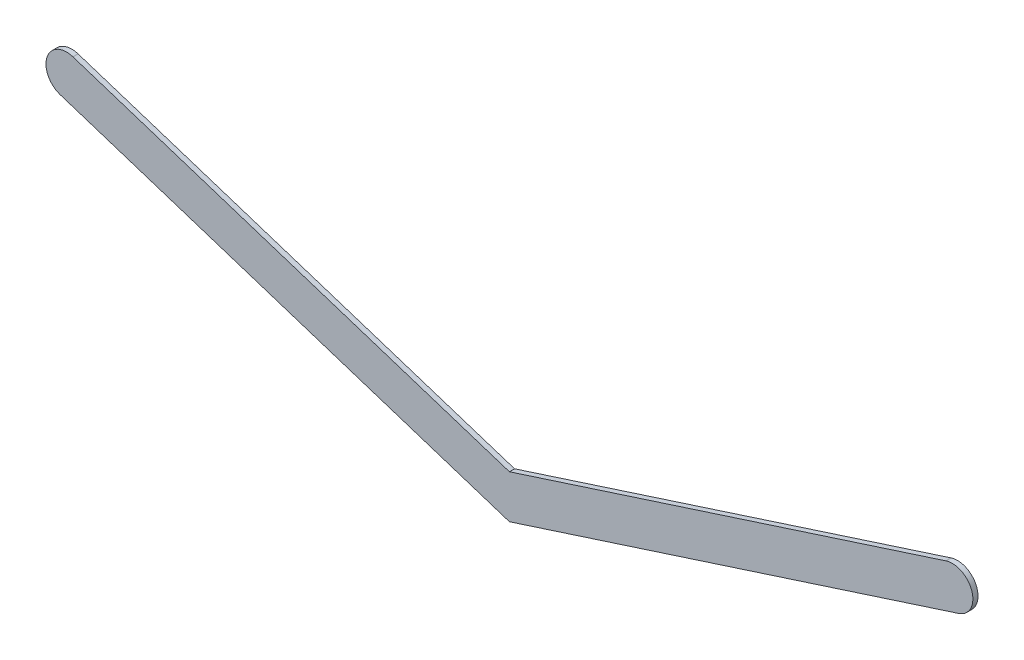
ISO-10303-21;
HEADER;
FILE_DESCRIPTION(('STEP AP214'),'2;1');
FILE_NAME('part.step','',(''),(''),'','','');
FILE_SCHEMA(('AUTOMOTIVE_DESIGN { 1 0 10303 214 1 1 1 1 }'));
ENDSEC;
DATA;
#1=APPLICATION_CONTEXT('core data for automotive mechanical design processes');
#2=APPLICATION_PROTOCOL_DEFINITION('international standard','automotive_design',2000,#1);
#3=PRODUCT_CONTEXT('',#1,'mechanical');
#4=PRODUCT('Part','Part','',(#3));
#5=PRODUCT_RELATED_PRODUCT_CATEGORY('part','',(#4));
#6=PRODUCT_DEFINITION_FORMATION('','',#4);
#7=PRODUCT_DEFINITION_CONTEXT('part definition',#1,'design');
#8=PRODUCT_DEFINITION('design','',#6,#7);
#9=PRODUCT_DEFINITION_SHAPE('','',#8);
#10=(LENGTH_UNIT() NAMED_UNIT(*) SI_UNIT(.MILLI.,.METRE.));
#11=(NAMED_UNIT(*) PLANE_ANGLE_UNIT() SI_UNIT($,.RADIAN.));
#12=(NAMED_UNIT(*) SI_UNIT($,.STERADIAN.) SOLID_ANGLE_UNIT());
#13=UNCERTAINTY_MEASURE_WITH_UNIT(LENGTH_MEASURE(1.E-05),#10,'distance_accuracy_value','');
#14=(GEOMETRIC_REPRESENTATION_CONTEXT(3) GLOBAL_UNCERTAINTY_ASSIGNED_CONTEXT((#13)) GLOBAL_UNIT_ASSIGNED_CONTEXT((#10,
#11,#12)) REPRESENTATION_CONTEXT('',''));
#15=CARTESIAN_POINT('',(0.,0.,0.));
#16=DIRECTION('',(0.,0.,1.));
#17=DIRECTION('',(1.,0.,0.));
#18=AXIS2_PLACEMENT_3D('',#15,#16,#17);
#19=CARTESIAN_POINT('',(546.1,0.,3.175));
#20=DIRECTION('',(0.,0.,-1.));
#21=DIRECTION('',(-1.,0.,0.));
#22=AXIS2_PLACEMENT_3D('',#19,#20,#21);
#23=CYLINDRICAL_SURFACE('',#22,25.4);
#24=CARTESIAN_POINT('',(546.1,0.,-3.175));
#25=DIRECTION('',(0.,0.,1.));
#26=DIRECTION('',(1.,0.,0.));
#27=AXIS2_PLACEMENT_3D('',#24,#25,#26);
#28=CIRCLE('',#27,25.4);
#29=CARTESIAN_POINT('',(553.911696572008,-24.1689345372708,-3.175));
#30=VERTEX_POINT('',#29);
#31=CARTESIAN_POINT('',(538.288303427992,24.1689345372708,-3.175));
#32=VERTEX_POINT('',#31);
#33=EDGE_CURVE('E119',#30,#32,#28,.T.);
#34=ORIENTED_EDGE('',*,*,#33,.T.);
#35=DIRECTION('',(0.,0.,-1.));
#36=VECTOR('',#35,1.);
#37=CARTESIAN_POINT('',(538.288303427992,24.1689345372708,3.175));
#38=LINE('',#37,#36);
#39=CARTESIAN_POINT('',(538.288303427992,24.1689345372708,3.175));
#40=VERTEX_POINT('',#39);
#41=EDGE_CURVE('E11',#40,#32,#38,.T.);
#42=ORIENTED_EDGE('',*,*,#41,.F.);
#43=CARTESIAN_POINT('',(546.1,0.,3.175));
#44=DIRECTION('',(0.,0.,1.));
#45=DIRECTION('',(1.,0.,0.));
#46=AXIS2_PLACEMENT_3D('',#43,#44,#45);
#47=CIRCLE('',#46,25.4);
#48=CARTESIAN_POINT('',(553.911696572008,-24.1689345372708,3.175));
#49=VERTEX_POINT('',#48);
#50=EDGE_CURVE('E129',#49,#40,#47,.T.);
#51=ORIENTED_EDGE('',*,*,#50,.F.);
#52=DIRECTION('',(0.,0.,-1.));
#53=VECTOR('',#52,1.);
#54=CARTESIAN_POINT('',(553.911696572008,-24.1689345372708,3.175));
#55=LINE('',#54,#53);
#56=EDGE_CURVE('E115',#49,#30,#55,.T.);
#57=ORIENTED_EDGE('',*,*,#56,.T.);
#58=EDGE_LOOP('',(#34,#42,#51,#57));
#59=FACE_BOUND('',#58,.T.);
#60=ADVANCED_FACE('F35',(#59),#23,.T.);
#61=CARTESIAN_POINT('',(0.,-149.812458318748,3.175));
#62=DIRECTION('',(0.307547109134163,-0.951532855798064,0.));
#63=DIRECTION('',(0.951532855798064,0.307547109134163,0.));
#64=AXIS2_PLACEMENT_3D('',#61,#62,#63);
#65=PLANE('',#64);
#66=DIRECTION('',(-0.951532855798064,-0.307547109134163,0.));
#67=VECTOR('',#66,1.);
#68=CARTESIAN_POINT('',(0.,-149.812458318748,-3.175));
#69=LINE('',#68,#67);
#70=CARTESIAN_POINT('',(0.,-149.812458318748,-3.175));
#71=VERTEX_POINT('',#70);
#72=EDGE_CURVE('E122',#32,#71,#69,.T.);
#73=ORIENTED_EDGE('',*,*,#72,.T.);
#74=DIRECTION('',(0.,0.,-1.));
#75=VECTOR('',#74,1.);
#76=CARTESIAN_POINT('',(0.,-149.812458318748,3.175));
#77=LINE('',#76,#75);
#78=CARTESIAN_POINT('',(0.,-149.812458318748,3.175));
#79=VERTEX_POINT('',#78);
#80=EDGE_CURVE('E43',#79,#71,#77,.T.);
#81=ORIENTED_EDGE('',*,*,#80,.F.);
#82=DIRECTION('',(-0.951532855798064,-0.307547109134163,0.));
#83=VECTOR('',#82,1.);
#84=CARTESIAN_POINT('',(0.,-149.812458318748,3.175));
#85=LINE('',#84,#83);
#86=EDGE_CURVE('E88',#40,#79,#85,.T.);
#87=ORIENTED_EDGE('',*,*,#86,.F.);
#88=ORIENTED_EDGE('',*,*,#41,.T.);
#89=EDGE_LOOP('',(#73,#81,#87,#88));
#90=FACE_BOUND('',#89,.T.);
#91=ADVANCED_FACE('F153',(#90),#65,.F.);
#92=CARTESIAN_POINT('',(-538.288303427992,24.1689345372709,3.175));
#93=DIRECTION('',(-0.307547109134163,-0.951532855798064,0.));
#94=DIRECTION('',(0.951532855798064,-0.307547109134163,0.));
#95=AXIS2_PLACEMENT_3D('',#92,#93,#94);
#96=PLANE('',#95);
#97=DIRECTION('',(-0.951532855798064,0.307547109134163,0.));
#98=VECTOR('',#97,1.);
#99=CARTESIAN_POINT('',(-538.288303427992,24.1689345372709,-3.175));
#100=LINE('',#99,#98);
#101=CARTESIAN_POINT('',(-538.288303427992,24.1689345372709,-3.175));
#102=VERTEX_POINT('',#101);
#103=EDGE_CURVE('E124',#71,#102,#100,.T.);
#104=ORIENTED_EDGE('',*,*,#103,.T.);
#105=DIRECTION('',(0.,0.,-1.));
#106=VECTOR('',#105,1.);
#107=CARTESIAN_POINT('',(-538.288303427992,24.1689345372709,3.175));
#108=LINE('',#107,#106);
#109=CARTESIAN_POINT('',(-538.288303427992,24.1689345372709,3.175));
#110=VERTEX_POINT('',#109);
#111=EDGE_CURVE('E110',#110,#102,#108,.T.);
#112=ORIENTED_EDGE('',*,*,#111,.F.);
#113=DIRECTION('',(-0.951532855798064,0.307547109134163,0.));
#114=VECTOR('',#113,1.);
#115=CARTESIAN_POINT('',(-538.288303427992,24.1689345372709,3.175));
#116=LINE('',#115,#114);
#117=EDGE_CURVE('E101',#79,#110,#116,.T.);
#118=ORIENTED_EDGE('',*,*,#117,.F.);
#119=ORIENTED_EDGE('',*,*,#80,.T.);
#120=EDGE_LOOP('',(#104,#112,#118,#119));
#121=FACE_BOUND('',#120,.T.);
#122=ADVANCED_FACE('F135',(#121),#96,.F.);
#123=CARTESIAN_POINT('',(-546.1,0.,3.175));
#124=DIRECTION('',(0.,0.,-1.));
#125=DIRECTION('',(-1.,0.,0.));
#126=AXIS2_PLACEMENT_3D('',#123,#124,#125);
#127=CYLINDRICAL_SURFACE('',#126,25.4);
#128=CARTESIAN_POINT('',(-546.1,0.,-3.175));
#129=DIRECTION('',(0.,0.,1.));
#130=DIRECTION('',(1.,0.,0.));
#131=AXIS2_PLACEMENT_3D('',#128,#129,#130);
#132=CIRCLE('',#131,25.4);
#133=CARTESIAN_POINT('',(-553.911696572008,-24.1689345372709,-3.175));
#134=VERTEX_POINT('',#133);
#135=EDGE_CURVE('E109',#102,#134,#132,.T.);
#136=ORIENTED_EDGE('',*,*,#135,.T.);
#137=DIRECTION('',(0.,0.,-1.));
#138=VECTOR('',#137,1.);
#139=CARTESIAN_POINT('',(-553.911696572008,-24.1689345372709,3.175));
#140=LINE('',#139,#138);
#141=CARTESIAN_POINT('',(-553.911696572008,-24.1689345372709,3.175));
#142=VERTEX_POINT('',#141);
#143=EDGE_CURVE('E106',#142,#134,#140,.T.);
#144=ORIENTED_EDGE('',*,*,#143,.F.);
#145=CARTESIAN_POINT('',(-546.1,0.,3.175));
#146=DIRECTION('',(0.,0.,1.));
#147=DIRECTION('',(1.,0.,0.));
#148=AXIS2_PLACEMENT_3D('',#145,#146,#147);
#149=CIRCLE('',#148,25.4);
#150=EDGE_CURVE('E95',#110,#142,#149,.T.);
#151=ORIENTED_EDGE('',*,*,#150,.F.);
#152=ORIENTED_EDGE('',*,*,#111,.T.);
#153=EDGE_LOOP('',(#136,#144,#151,#152));
#154=FACE_BOUND('',#153,.T.);
#155=ADVANCED_FACE('F107',(#154),#127,.T.);
#156=CARTESIAN_POINT('',(-553.911696572008,-24.1689345372709,3.175));
#157=DIRECTION('',(0.307547109134163,0.951532855798064,0.));
#158=DIRECTION('',(-0.951532855798064,0.307547109134163,0.));
#159=AXIS2_PLACEMENT_3D('',#156,#157,#158);
#160=PLANE('',#159);
#161=DIRECTION('',(0.951532855798064,-0.307547109134163,0.));
#162=VECTOR('',#161,1.);
#163=CARTESIAN_POINT('',(-553.911696572008,-24.1689345372709,-3.175));
#164=LINE('',#163,#162);
#165=CARTESIAN_POINT('',(0.,-203.2,-3.175));
#166=VERTEX_POINT('',#165);
#167=EDGE_CURVE('E74',#134,#166,#164,.T.);
#168=ORIENTED_EDGE('',*,*,#167,.T.);
#169=DIRECTION('',(0.,0.,-1.));
#170=VECTOR('',#169,1.);
#171=CARTESIAN_POINT('',(0.,-203.2,3.175));
#172=LINE('',#171,#170);
#173=CARTESIAN_POINT('',(0.,-203.2,3.175));
#174=VERTEX_POINT('',#173);
#175=EDGE_CURVE('E111',#174,#166,#172,.T.);
#176=ORIENTED_EDGE('',*,*,#175,.F.);
#177=DIRECTION('',(0.951532855798064,-0.307547109134163,0.));
#178=VECTOR('',#177,1.);
#179=CARTESIAN_POINT('',(-553.911696572008,-24.1689345372709,3.175));
#180=LINE('',#179,#178);
#181=EDGE_CURVE('E99',#142,#174,#180,.T.);
#182=ORIENTED_EDGE('',*,*,#181,.F.);
#183=ORIENTED_EDGE('',*,*,#143,.T.);
#184=EDGE_LOOP('',(#168,#176,#182,#183));
#185=FACE_BOUND('',#184,.T.);
#186=ADVANCED_FACE('F113',(#185),#160,.F.);
#187=CARTESIAN_POINT('',(0.,-203.2,3.175));
#188=DIRECTION('',(-0.307547109134163,0.951532855798064,0.));
#189=DIRECTION('',(-0.951532855798064,-0.307547109134163,0.));
#190=AXIS2_PLACEMENT_3D('',#187,#188,#189);
#191=PLANE('',#190);
#192=DIRECTION('',(0.951532855798064,0.307547109134163,0.));
#193=VECTOR('',#192,1.);
#194=CARTESIAN_POINT('',(0.,-203.2,-3.175));
#195=LINE('',#194,#193);
#196=EDGE_CURVE('E80',#166,#30,#195,.T.);
#197=ORIENTED_EDGE('',*,*,#196,.T.);
#198=ORIENTED_EDGE('',*,*,#56,.F.);
#199=DIRECTION('',(0.951532855798064,0.307547109134163,0.));
#200=VECTOR('',#199,1.);
#201=CARTESIAN_POINT('',(0.,-203.2,3.175));
#202=LINE('',#201,#200);
#203=EDGE_CURVE('E51',#174,#49,#202,.T.);
#204=ORIENTED_EDGE('',*,*,#203,.F.);
#205=ORIENTED_EDGE('',*,*,#175,.T.);
#206=EDGE_LOOP('',(#197,#198,#204,#205));
#207=FACE_BOUND('',#206,.T.);
#208=ADVANCED_FACE('F142',(#207),#191,.F.);
#209=CARTESIAN_POINT('',(546.1,0.,3.175));
#210=DIRECTION('',(0.,0.,1.));
#211=DIRECTION('',(1.,0.,0.));
#212=AXIS2_PLACEMENT_3D('',#209,#210,#211);
#213=PLANE('',#212);
#214=ORIENTED_EDGE('',*,*,#50,.T.);
#215=ORIENTED_EDGE('',*,*,#86,.T.);
#216=ORIENTED_EDGE('',*,*,#117,.T.);
#217=ORIENTED_EDGE('',*,*,#150,.T.);
#218=ORIENTED_EDGE('',*,*,#181,.T.);
#219=ORIENTED_EDGE('',*,*,#203,.T.);
#220=EDGE_LOOP('',(#214,#215,#216,#217,#218,#219));
#221=FACE_BOUND('',#220,.T.);
#222=ADVANCED_FACE('F97',(#221),#213,.T.);
#223=CARTESIAN_POINT('',(546.1,0.,-3.175));
#224=DIRECTION('',(0.,0.,1.));
#225=DIRECTION('',(1.,0.,0.));
#226=AXIS2_PLACEMENT_3D('',#223,#224,#225);
#227=PLANE('',#226);
#228=ORIENTED_EDGE('',*,*,#33,.F.);
#229=ORIENTED_EDGE('',*,*,#196,.F.);
#230=ORIENTED_EDGE('',*,*,#167,.F.);
#231=ORIENTED_EDGE('',*,*,#135,.F.);
#232=ORIENTED_EDGE('',*,*,#103,.F.);
#233=ORIENTED_EDGE('',*,*,#72,.F.);
#234=EDGE_LOOP('',(#228,#229,#230,#231,#232,#233));
#235=FACE_BOUND('',#234,.T.);
#236=ADVANCED_FACE('F138',(#235),#227,.F.);
#237=CLOSED_SHELL('',(#60,#91,#122,#155,#186,#208,#222,#236));
#238=MANIFOLD_SOLID_BREP('B2',#237);
#239=ADVANCED_BREP_SHAPE_REPRESENTATION('',(#18,#238),#14);
#240=SHAPE_DEFINITION_REPRESENTATION(#9,#239);
ENDSEC;
END-ISO-10303-21;
